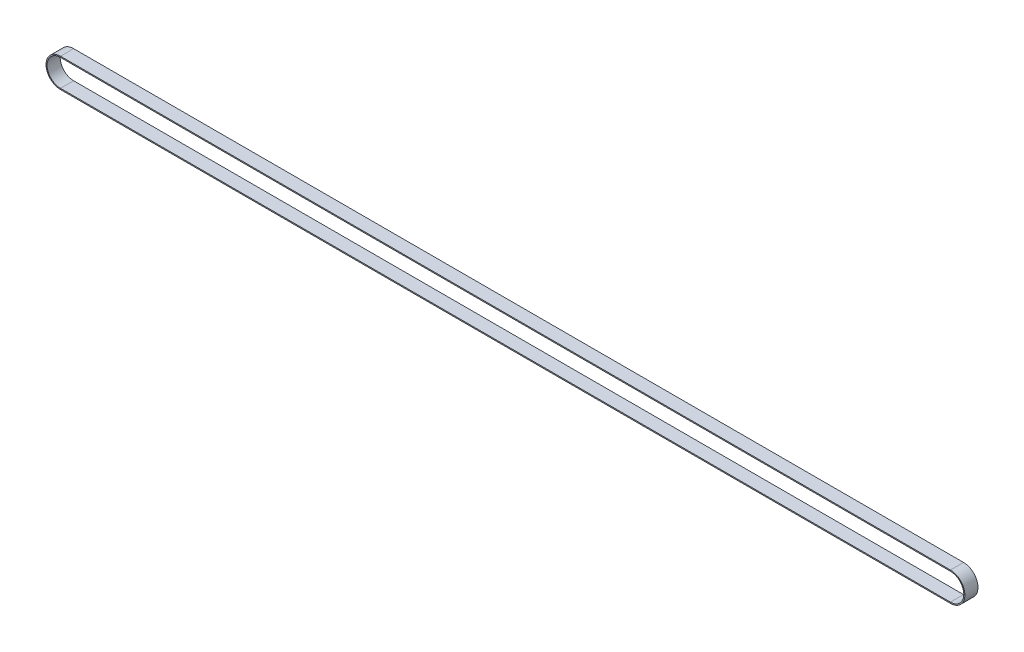
ISO-10303-21;
HEADER;
FILE_DESCRIPTION(('STEP AP214'),'2;1');
FILE_NAME('part.step','',(''),(''),'','','');
FILE_SCHEMA(('AUTOMOTIVE_DESIGN { 1 0 10303 214 1 1 1 1 }'));
ENDSEC;
DATA;
#1=APPLICATION_CONTEXT('core data for automotive mechanical design processes');
#2=APPLICATION_PROTOCOL_DEFINITION('international standard','automotive_design',2000,#1);
#3=PRODUCT_CONTEXT('',#1,'mechanical');
#4=PRODUCT('Part','Part','',(#3));
#5=PRODUCT_RELATED_PRODUCT_CATEGORY('part','',(#4));
#6=PRODUCT_DEFINITION_FORMATION('','',#4);
#7=PRODUCT_DEFINITION_CONTEXT('part definition',#1,'design');
#8=PRODUCT_DEFINITION('design','',#6,#7);
#9=PRODUCT_DEFINITION_SHAPE('','',#8);
#10=(LENGTH_UNIT() NAMED_UNIT(*) SI_UNIT(.MILLI.,.METRE.));
#11=(NAMED_UNIT(*) PLANE_ANGLE_UNIT() SI_UNIT($,.RADIAN.));
#12=(NAMED_UNIT(*) SI_UNIT($,.STERADIAN.) SOLID_ANGLE_UNIT());
#13=UNCERTAINTY_MEASURE_WITH_UNIT(LENGTH_MEASURE(1.E-05),#10,'distance_accuracy_value','');
#14=(GEOMETRIC_REPRESENTATION_CONTEXT(3) GLOBAL_UNCERTAINTY_ASSIGNED_CONTEXT((#13)) GLOBAL_UNIT_ASSIGNED_CONTEXT((#10,
#11,#12)) REPRESENTATION_CONTEXT('',''));
#15=CARTESIAN_POINT('',(0.,0.,0.));
#16=DIRECTION('',(0.,0.,1.));
#17=DIRECTION('',(1.,0.,0.));
#18=AXIS2_PLACEMENT_3D('',#15,#16,#17);
#19=CARTESIAN_POINT('',(390.975000000004,5.43119624401145,-3.));
#20=DIRECTION('',(0.,-1.,0.));
#21=DIRECTION('',(1.,0.,0.));
#22=AXIS2_PLACEMENT_3D('',#19,#20,#21);
#23=PLANE('',#22);
#24=DIRECTION('',(0.,0.,1.));
#25=VECTOR('',#24,1.);
#26=CARTESIAN_POINT('',(390.975000000004,5.43119624401139,-3.));
#27=LINE('',#26,#25);
#28=CARTESIAN_POINT('',(390.975000000004,5.43119624401145,-3.));
#29=VERTEX_POINT('',#28);
#30=CARTESIAN_POINT('',(390.975000000004,5.43119624401145,3.));
#31=VERTEX_POINT('',#30);
#32=EDGE_CURVE('E164',#29,#31,#27,.T.);
#33=ORIENTED_EDGE('',*,*,#32,.F.);
#34=DIRECTION('',(-1.,0.,0.));
#35=VECTOR('',#34,1.);
#36=CARTESIAN_POINT('',(390.975000000004,5.43119624401145,-3.));
#37=LINE('',#36,#35);
#38=CARTESIAN_POINT('',(-15.9999999999961,5.43119624400989,-3.));
#39=VERTEX_POINT('',#38);
#40=EDGE_CURVE('E163',#29,#39,#37,.T.);
#41=ORIENTED_EDGE('',*,*,#40,.T.);
#42=DIRECTION('',(0.,0.,1.));
#43=VECTOR('',#42,1.);
#44=CARTESIAN_POINT('',(-15.9999999999961,5.43119624400989,-3.));
#45=LINE('',#44,#43);
#46=CARTESIAN_POINT('',(-15.9999999999961,5.43119624400989,3.));
#47=VERTEX_POINT('',#46);
#48=EDGE_CURVE('E140',#39,#47,#45,.T.);
#49=ORIENTED_EDGE('',*,*,#48,.T.);
#50=DIRECTION('',(-1.,0.,0.));
#51=VECTOR('',#50,1.);
#52=CARTESIAN_POINT('',(390.975000000004,5.43119624401145,3.));
#53=LINE('',#52,#51);
#54=EDGE_CURVE('E169',#31,#47,#53,.T.);
#55=ORIENTED_EDGE('',*,*,#54,.F.);
#56=EDGE_LOOP('',(#33,#41,#49,#55));
#57=FACE_BOUND('',#56,.T.);
#58=ADVANCED_FACE('F45',(#57),#23,.F.);
#59=CARTESIAN_POINT('',(-15.9999999999961,-1.17880375599011,0.));
#60=DIRECTION('',(0.,0.,1.));
#61=DIRECTION('',(1.,0.,0.));
#62=AXIS2_PLACEMENT_3D('',#59,#60,#61);
#63=CYLINDRICAL_SURFACE('',#62,6.61);
#64=CARTESIAN_POINT('',(-15.9999999999961,-1.17880375599011,3.));
#65=DIRECTION('',(0.,0.,1.));
#66=DIRECTION('',(0.,1.,0.));
#67=AXIS2_PLACEMENT_3D('',#64,#65,#66);
#68=CIRCLE('',#67,6.61);
#69=CARTESIAN_POINT('',(-15.999999999996,-7.78880375599011,3.));
#70=VERTEX_POINT('',#69);
#71=EDGE_CURVE('E130',#47,#70,#68,.T.);
#72=ORIENTED_EDGE('',*,*,#71,.F.);
#73=ORIENTED_EDGE('',*,*,#48,.F.);
#74=CARTESIAN_POINT('',(-15.9999999999961,-1.17880375599011,-3.));
#75=DIRECTION('',(0.,0.,1.));
#76=DIRECTION('',(0.,1.,0.));
#77=AXIS2_PLACEMENT_3D('',#74,#75,#76);
#78=CIRCLE('',#77,6.61);
#79=CARTESIAN_POINT('',(-15.999999999996,-7.78880375599011,-3.));
#80=VERTEX_POINT('',#79);
#81=EDGE_CURVE('E143',#39,#80,#78,.T.);
#82=ORIENTED_EDGE('',*,*,#81,.T.);
#83=DIRECTION('',(0.,0.,1.));
#84=VECTOR('',#83,1.);
#85=CARTESIAN_POINT('',(-15.999999999996,-7.78880375599011,-3.));
#86=LINE('',#85,#84);
#87=EDGE_CURVE('E160',#80,#70,#86,.T.);
#88=ORIENTED_EDGE('',*,*,#87,.T.);
#89=EDGE_LOOP('',(#72,#73,#82,#88));
#90=FACE_BOUND('',#89,.T.);
#91=ADVANCED_FACE('F142',(#90),#63,.T.);
#92=CARTESIAN_POINT('',(-15.9999999999961,5.43119624400989,3.));
#93=DIRECTION('',(0.,0.,-1.));
#94=DIRECTION('',(-1.,0.,0.));
#95=AXIS2_PLACEMENT_3D('',#92,#93,#94);
#96=PLANE('',#95);
#97=CARTESIAN_POINT('',(-15.9999999999961,-1.17880375599011,3.));
#98=DIRECTION('',(0.,0.,1.));
#99=DIRECTION('',(0.,1.,0.));
#100=AXIS2_PLACEMENT_3D('',#97,#98,#99);
#101=CIRCLE('',#100,6.11);
#102=CARTESIAN_POINT('',(-15.9999999999961,4.93119624400989,3.));
#103=VERTEX_POINT('',#102);
#104=CARTESIAN_POINT('',(-15.999999999996,-7.28880375599011,3.));
#105=VERTEX_POINT('',#104);
#106=EDGE_CURVE('E124',#103,#105,#101,.T.);
#107=ORIENTED_EDGE('',*,*,#106,.F.);
#108=DIRECTION('',(0.,-1.,0.));
#109=VECTOR('',#108,1.);
#110=CARTESIAN_POINT('',(-15.9999999999961,5.43119624400989,3.));
#111=LINE('',#110,#109);
#112=EDGE_CURVE('E149',#47,#103,#111,.T.);
#113=ORIENTED_EDGE('',*,*,#112,.F.);
#114=ORIENTED_EDGE('',*,*,#71,.T.);
#115=DIRECTION('',(0.,1.,0.));
#116=VECTOR('',#115,1.);
#117=CARTESIAN_POINT('',(-15.999999999996,-7.78880375599011,3.));
#118=LINE('',#117,#116);
#119=EDGE_CURVE('E227',#70,#105,#118,.T.);
#120=ORIENTED_EDGE('',*,*,#119,.T.);
#121=EDGE_LOOP('',(#107,#113,#114,#120));
#122=FACE_BOUND('',#121,.T.);
#123=ADVANCED_FACE('F256',(#122),#96,.F.);
#124=CARTESIAN_POINT('',(-15.9999999999961,-1.17880375599011,0.));
#125=DIRECTION('',(0.,0.,1.));
#126=DIRECTION('',(1.,0.,0.));
#127=AXIS2_PLACEMENT_3D('',#124,#125,#126);
#128=CYLINDRICAL_SURFACE('',#127,6.11);
#129=CARTESIAN_POINT('',(-15.9999999999961,-1.17880375599011,-3.));
#130=DIRECTION('',(0.,0.,1.));
#131=DIRECTION('',(0.,1.,0.));
#132=AXIS2_PLACEMENT_3D('',#129,#130,#131);
#133=CIRCLE('',#132,6.11);
#134=CARTESIAN_POINT('',(-15.9999999999961,4.93119624400989,-3.));
#135=VERTEX_POINT('',#134);
#136=CARTESIAN_POINT('',(-15.999999999996,-7.28880375599011,-3.));
#137=VERTEX_POINT('',#136);
#138=EDGE_CURVE('E182',#135,#137,#133,.T.);
#139=ORIENTED_EDGE('',*,*,#138,.F.);
#140=DIRECTION('',(0.,0.,-1.));
#141=VECTOR('',#140,1.);
#142=CARTESIAN_POINT('',(-15.9999999999961,4.93119624400989,-3.));
#143=LINE('',#142,#141);
#144=EDGE_CURVE('E173',#103,#135,#143,.T.);
#145=ORIENTED_EDGE('',*,*,#144,.F.);
#146=ORIENTED_EDGE('',*,*,#106,.T.);
#147=DIRECTION('',(0.,0.,-1.));
#148=VECTOR('',#147,1.);
#149=CARTESIAN_POINT('',(-15.999999999996,-7.28880375599011,-3.));
#150=LINE('',#149,#148);
#151=EDGE_CURVE('E207',#105,#137,#150,.T.);
#152=ORIENTED_EDGE('',*,*,#151,.T.);
#153=EDGE_LOOP('',(#139,#145,#146,#152));
#154=FACE_BOUND('',#153,.T.);
#155=ADVANCED_FACE('F206',(#154),#128,.F.);
#156=CARTESIAN_POINT('',(-15.9999999999961,5.43119624400989,-3.));
#157=DIRECTION('',(0.,0.,1.));
#158=DIRECTION('',(1.,0.,0.));
#159=AXIS2_PLACEMENT_3D('',#156,#157,#158);
#160=PLANE('',#159);
#161=DIRECTION('',(0.,-1.,0.));
#162=VECTOR('',#161,1.);
#163=CARTESIAN_POINT('',(-15.999999999996,-7.78880375599011,-3.));
#164=LINE('',#163,#162);
#165=EDGE_CURVE('E157',#137,#80,#164,.T.);
#166=ORIENTED_EDGE('',*,*,#165,.T.);
#167=ORIENTED_EDGE('',*,*,#81,.F.);
#168=DIRECTION('',(0.,1.,0.));
#169=VECTOR('',#168,1.);
#170=CARTESIAN_POINT('',(-15.9999999999961,5.43119624400989,-3.));
#171=LINE('',#170,#169);
#172=EDGE_CURVE('E156',#135,#39,#171,.T.);
#173=ORIENTED_EDGE('',*,*,#172,.F.);
#174=ORIENTED_EDGE('',*,*,#138,.T.);
#175=EDGE_LOOP('',(#166,#167,#173,#174));
#176=FACE_BOUND('',#175,.T.);
#177=ADVANCED_FACE('F154',(#176),#160,.F.);
#178=CARTESIAN_POINT('',(-15.9999999999961,-7.78880375599011,-3.));
#179=DIRECTION('',(0.,1.,0.));
#180=DIRECTION('',(-1.,0.,0.));
#181=AXIS2_PLACEMENT_3D('',#178,#179,#180);
#182=PLANE('',#181);
#183=DIRECTION('',(1.,0.,0.));
#184=VECTOR('',#183,1.);
#185=CARTESIAN_POINT('',(-15.9999999999961,-7.78880375599011,3.));
#186=LINE('',#185,#184);
#187=CARTESIAN_POINT('',(390.975000000004,-7.78880375598856,3.));
#188=VERTEX_POINT('',#187);
#189=EDGE_CURVE('E111',#70,#188,#186,.T.);
#190=ORIENTED_EDGE('',*,*,#189,.F.);
#191=ORIENTED_EDGE('',*,*,#87,.F.);
#192=DIRECTION('',(1.,0.,0.));
#193=VECTOR('',#192,1.);
#194=CARTESIAN_POINT('',(-15.9999999999961,-7.78880375599011,-3.));
#195=LINE('',#194,#193);
#196=CARTESIAN_POINT('',(390.975000000004,-7.78880375598856,-3.));
#197=VERTEX_POINT('',#196);
#198=EDGE_CURVE('E181',#80,#197,#195,.T.);
#199=ORIENTED_EDGE('',*,*,#198,.T.);
#200=DIRECTION('',(0.,0.,1.));
#201=VECTOR('',#200,1.);
#202=CARTESIAN_POINT('',(390.975000000004,-7.78880375598856,-3.));
#203=LINE('',#202,#201);
#204=EDGE_CURVE('E243',#197,#188,#203,.T.);
#205=ORIENTED_EDGE('',*,*,#204,.T.);
#206=EDGE_LOOP('',(#190,#191,#199,#205));
#207=FACE_BOUND('',#206,.T.);
#208=ADVANCED_FACE('F252',(#207),#182,.F.);
#209=CARTESIAN_POINT('',(-15.9999999999961,-7.78880375599011,3.));
#210=DIRECTION('',(0.,0.,-1.));
#211=DIRECTION('',(0.,1.,0.));
#212=AXIS2_PLACEMENT_3D('',#209,#210,#211);
#213=PLANE('',#212);
#214=DIRECTION('',(1.,0.,0.));
#215=VECTOR('',#214,1.);
#216=CARTESIAN_POINT('',(-15.9999999999961,-7.28880375599011,3.));
#217=LINE('',#216,#215);
#218=CARTESIAN_POINT('',(390.975000000004,-7.28880375598856,3.));
#219=VERTEX_POINT('',#218);
#220=EDGE_CURVE('E104',#105,#219,#217,.T.);
#221=ORIENTED_EDGE('',*,*,#220,.F.);
#222=ORIENTED_EDGE('',*,*,#119,.F.);
#223=ORIENTED_EDGE('',*,*,#189,.T.);
#224=DIRECTION('',(0.,1.,0.));
#225=VECTOR('',#224,1.);
#226=CARTESIAN_POINT('',(390.975000000004,-7.78880375598856,3.));
#227=LINE('',#226,#225);
#228=EDGE_CURVE('E222',#188,#219,#227,.T.);
#229=ORIENTED_EDGE('',*,*,#228,.T.);
#230=EDGE_LOOP('',(#221,#222,#223,#229));
#231=FACE_BOUND('',#230,.T.);
#232=ADVANCED_FACE('F255',(#231),#213,.F.);
#233=CARTESIAN_POINT('',(-15.9999999999961,-7.28880375599011,-3.));
#234=DIRECTION('',(0.,-1.,0.));
#235=DIRECTION('',(1.,0.,0.));
#236=AXIS2_PLACEMENT_3D('',#233,#234,#235);
#237=PLANE('',#236);
#238=DIRECTION('',(1.,0.,0.));
#239=VECTOR('',#238,1.);
#240=CARTESIAN_POINT('',(-15.9999999999961,-7.28880375599011,-3.));
#241=LINE('',#240,#239);
#242=CARTESIAN_POINT('',(390.975000000004,-7.28880375598856,-3.));
#243=VERTEX_POINT('',#242);
#244=EDGE_CURVE('E95',#137,#243,#241,.T.);
#245=ORIENTED_EDGE('',*,*,#244,.F.);
#246=ORIENTED_EDGE('',*,*,#151,.F.);
#247=ORIENTED_EDGE('',*,*,#220,.T.);
#248=DIRECTION('',(0.,0.,-1.));
#249=VECTOR('',#248,1.);
#250=CARTESIAN_POINT('',(390.975000000004,-7.28880375598856,-3.));
#251=LINE('',#250,#249);
#252=EDGE_CURVE('E190',#219,#243,#251,.T.);
#253=ORIENTED_EDGE('',*,*,#252,.T.);
#254=EDGE_LOOP('',(#245,#246,#247,#253));
#255=FACE_BOUND('',#254,.T.);
#256=ADVANCED_FACE('F274',(#255),#237,.F.);
#257=CARTESIAN_POINT('',(-15.9999999999961,-7.78880375599011,-3.));
#258=DIRECTION('',(0.,0.,1.));
#259=DIRECTION('',(0.,-1.,0.));
#260=AXIS2_PLACEMENT_3D('',#257,#258,#259);
#261=PLANE('',#260);
#262=DIRECTION('',(0.,-1.,0.));
#263=VECTOR('',#262,1.);
#264=CARTESIAN_POINT('',(390.975000000004,-7.78880375598856,-3.));
#265=LINE('',#264,#263);
#266=EDGE_CURVE('E183',#243,#197,#265,.T.);
#267=ORIENTED_EDGE('',*,*,#266,.T.);
#268=ORIENTED_EDGE('',*,*,#198,.F.);
#269=ORIENTED_EDGE('',*,*,#165,.F.);
#270=ORIENTED_EDGE('',*,*,#244,.T.);
#271=EDGE_LOOP('',(#267,#268,#269,#270));
#272=FACE_BOUND('',#271,.T.);
#273=ADVANCED_FACE('F266',(#272),#261,.F.);
#274=CARTESIAN_POINT('',(390.975000000004,-1.17880375598856,0.));
#275=DIRECTION('',(0.,0.,1.));
#276=DIRECTION('',(1.,0.,0.));
#277=AXIS2_PLACEMENT_3D('',#274,#275,#276);
#278=CYLINDRICAL_SURFACE('',#277,6.61);
#279=CARTESIAN_POINT('',(390.975000000004,-1.17880375598856,3.));
#280=DIRECTION('',(0.,0.,1.));
#281=DIRECTION('',(0.,-1.,0.));
#282=AXIS2_PLACEMENT_3D('',#279,#280,#281);
#283=CIRCLE('',#282,6.61);
#284=EDGE_CURVE('E219',#188,#31,#283,.T.);
#285=ORIENTED_EDGE('',*,*,#284,.F.);
#286=ORIENTED_EDGE('',*,*,#204,.F.);
#287=CARTESIAN_POINT('',(390.975000000004,-1.17880375598856,-3.));
#288=DIRECTION('',(0.,0.,1.));
#289=DIRECTION('',(0.,-1.,0.));
#290=AXIS2_PLACEMENT_3D('',#287,#288,#289);
#291=CIRCLE('',#290,6.61);
#292=EDGE_CURVE('E185',#197,#29,#291,.T.);
#293=ORIENTED_EDGE('',*,*,#292,.T.);
#294=ORIENTED_EDGE('',*,*,#32,.T.);
#295=EDGE_LOOP('',(#285,#286,#293,#294));
#296=FACE_BOUND('',#295,.T.);
#297=ADVANCED_FACE('F264',(#296),#278,.T.);
#298=CARTESIAN_POINT('',(390.975000000004,-7.78880375598856,3.));
#299=DIRECTION('',(0.,0.,-1.));
#300=DIRECTION('',(-1.,0.,0.));
#301=AXIS2_PLACEMENT_3D('',#298,#299,#300);
#302=PLANE('',#301);
#303=CARTESIAN_POINT('',(390.975000000004,-1.17880375598856,3.));
#304=DIRECTION('',(0.,0.,1.));
#305=DIRECTION('',(0.,-1.,0.));
#306=AXIS2_PLACEMENT_3D('',#303,#304,#305);
#307=CIRCLE('',#306,6.11);
#308=CARTESIAN_POINT('',(390.975000000004,4.93119624401145,3.));
#309=VERTEX_POINT('',#308);
#310=EDGE_CURVE('E71',#219,#309,#307,.T.);
#311=ORIENTED_EDGE('',*,*,#310,.F.);
#312=ORIENTED_EDGE('',*,*,#228,.F.);
#313=ORIENTED_EDGE('',*,*,#284,.T.);
#314=DIRECTION('',(0.,-1.,0.));
#315=VECTOR('',#314,1.);
#316=CARTESIAN_POINT('',(390.975000000004,5.43119624401139,3.));
#317=LINE('',#316,#315);
#318=EDGE_CURVE('E216',#31,#309,#317,.T.);
#319=ORIENTED_EDGE('',*,*,#318,.T.);
#320=EDGE_LOOP('',(#311,#312,#313,#319));
#321=FACE_BOUND('',#320,.T.);
#322=ADVANCED_FACE('F261',(#321),#302,.F.);
#323=CARTESIAN_POINT('',(390.975000000004,-1.17880375598856,0.));
#324=DIRECTION('',(0.,0.,1.));
#325=DIRECTION('',(1.,0.,0.));
#326=AXIS2_PLACEMENT_3D('',#323,#324,#325);
#327=CYLINDRICAL_SURFACE('',#326,6.11);
#328=CARTESIAN_POINT('',(390.975000000004,-1.17880375598856,-3.));
#329=DIRECTION('',(0.,0.,1.));
#330=DIRECTION('',(0.,-1.,0.));
#331=AXIS2_PLACEMENT_3D('',#328,#329,#330);
#332=CIRCLE('',#331,6.11);
#333=CARTESIAN_POINT('',(390.975000000004,4.93119624401145,-3.));
#334=VERTEX_POINT('',#333);
#335=EDGE_CURVE('E63',#243,#334,#332,.T.);
#336=ORIENTED_EDGE('',*,*,#335,.F.);
#337=ORIENTED_EDGE('',*,*,#252,.F.);
#338=ORIENTED_EDGE('',*,*,#310,.T.);
#339=DIRECTION('',(0.,0.,-1.));
#340=VECTOR('',#339,1.);
#341=CARTESIAN_POINT('',(390.975000000004,4.93119624401139,-3.));
#342=LINE('',#341,#340);
#343=EDGE_CURVE('E196',#309,#334,#342,.T.);
#344=ORIENTED_EDGE('',*,*,#343,.T.);
#345=EDGE_LOOP('',(#336,#337,#338,#344));
#346=FACE_BOUND('',#345,.T.);
#347=ADVANCED_FACE('F272',(#346),#327,.F.);
#348=CARTESIAN_POINT('',(390.975000000004,-7.78880375598856,-3.));
#349=DIRECTION('',(0.,0.,1.));
#350=DIRECTION('',(1.,0.,0.));
#351=AXIS2_PLACEMENT_3D('',#348,#349,#350);
#352=PLANE('',#351);
#353=DIRECTION('',(0.,1.,0.));
#354=VECTOR('',#353,1.);
#355=CARTESIAN_POINT('',(390.975000000004,5.43119624401139,-3.));
#356=LINE('',#355,#354);
#357=EDGE_CURVE('E49',#334,#29,#356,.T.);
#358=ORIENTED_EDGE('',*,*,#357,.T.);
#359=ORIENTED_EDGE('',*,*,#292,.F.);
#360=ORIENTED_EDGE('',*,*,#266,.F.);
#361=ORIENTED_EDGE('',*,*,#335,.T.);
#362=EDGE_LOOP('',(#358,#359,#360,#361));
#363=FACE_BOUND('',#362,.T.);
#364=ADVANCED_FACE('F200',(#363),#352,.F.);
#365=CARTESIAN_POINT('',(390.975000000004,5.43119624401145,3.));
#366=DIRECTION('',(0.,0.,-1.));
#367=DIRECTION('',(0.,1.,0.));
#368=AXIS2_PLACEMENT_3D('',#365,#366,#367);
#369=PLANE('',#368);
#370=ORIENTED_EDGE('',*,*,#54,.T.);
#371=ORIENTED_EDGE('',*,*,#112,.T.);
#372=DIRECTION('',(-1.,0.,0.));
#373=VECTOR('',#372,1.);
#374=CARTESIAN_POINT('',(390.975000000004,4.93119624401145,3.));
#375=LINE('',#374,#373);
#376=EDGE_CURVE('E55',#309,#103,#375,.T.);
#377=ORIENTED_EDGE('',*,*,#376,.F.);
#378=ORIENTED_EDGE('',*,*,#318,.F.);
#379=EDGE_LOOP('',(#370,#371,#377,#378));
#380=FACE_BOUND('',#379,.T.);
#381=ADVANCED_FACE('F258',(#380),#369,.F.);
#382=CARTESIAN_POINT('',(390.975000000004,4.93119624401145,-3.));
#383=DIRECTION('',(0.,1.,0.));
#384=DIRECTION('',(-1.,0.,0.));
#385=AXIS2_PLACEMENT_3D('',#382,#383,#384);
#386=PLANE('',#385);
#387=ORIENTED_EDGE('',*,*,#376,.T.);
#388=ORIENTED_EDGE('',*,*,#144,.T.);
#389=DIRECTION('',(-1.,0.,0.));
#390=VECTOR('',#389,1.);
#391=CARTESIAN_POINT('',(390.975000000004,4.93119624401145,-3.));
#392=LINE('',#391,#390);
#393=EDGE_CURVE('E11',#334,#135,#392,.T.);
#394=ORIENTED_EDGE('',*,*,#393,.F.);
#395=ORIENTED_EDGE('',*,*,#343,.F.);
#396=EDGE_LOOP('',(#387,#388,#394,#395));
#397=FACE_BOUND('',#396,.T.);
#398=ADVANCED_FACE('F204',(#397),#386,.F.);
#399=CARTESIAN_POINT('',(390.975000000004,5.43119624401145,-3.));
#400=DIRECTION('',(0.,0.,1.));
#401=DIRECTION('',(0.,-1.,0.));
#402=AXIS2_PLACEMENT_3D('',#399,#400,#401);
#403=PLANE('',#402);
#404=ORIENTED_EDGE('',*,*,#393,.T.);
#405=ORIENTED_EDGE('',*,*,#172,.T.);
#406=ORIENTED_EDGE('',*,*,#40,.F.);
#407=ORIENTED_EDGE('',*,*,#357,.F.);
#408=EDGE_LOOP('',(#404,#405,#406,#407));
#409=FACE_BOUND('',#408,.T.);
#410=ADVANCED_FACE('F47',(#409),#403,.F.);
#411=CLOSED_SHELL('',(#58,#91,#123,#155,#177,#208,#232,#256,#273,#297,#322,#347,#364,#381,#398,#410));
#412=MANIFOLD_SOLID_BREP('B2',#411);
#413=ADVANCED_BREP_SHAPE_REPRESENTATION('',(#18,#412),#14);
#414=SHAPE_DEFINITION_REPRESENTATION(#9,#413);
ENDSEC;
END-ISO-10303-21;
